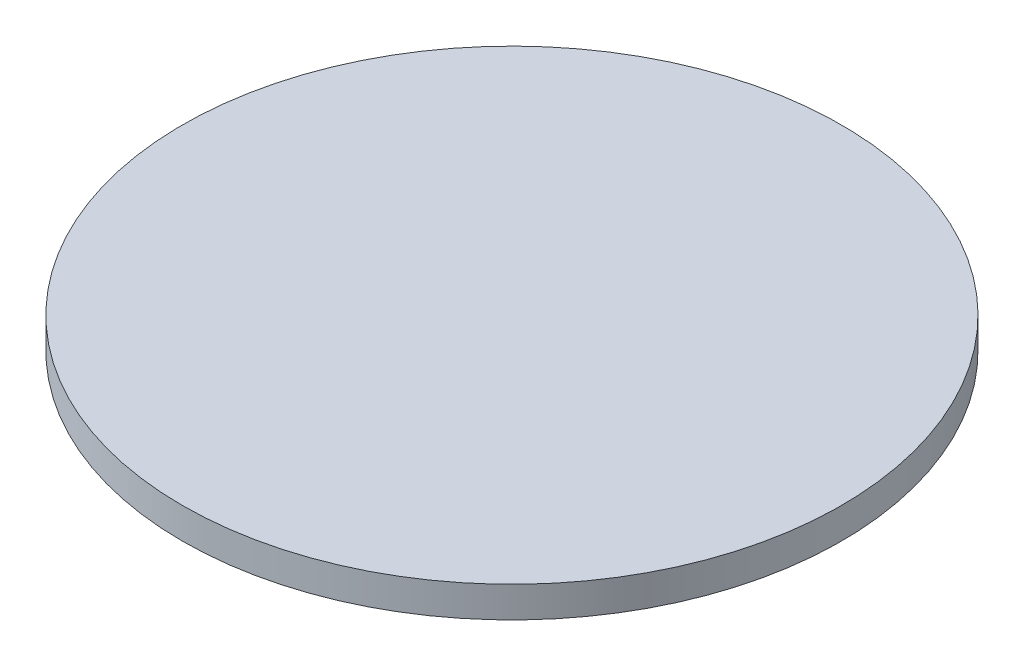
ISO-10303-21;
HEADER;
FILE_DESCRIPTION(('STEP AP214'),'2;1');
FILE_NAME('part.step','',(''),(''),'','','');
FILE_SCHEMA(('AUTOMOTIVE_DESIGN { 1 0 10303 214 1 1 1 1 }'));
ENDSEC;
DATA;
#1=APPLICATION_CONTEXT('core data for automotive mechanical design processes');
#2=APPLICATION_PROTOCOL_DEFINITION('international standard','automotive_design',2000,#1);
#3=PRODUCT_CONTEXT('',#1,'mechanical');
#4=PRODUCT('Part','Part','',(#3));
#5=PRODUCT_RELATED_PRODUCT_CATEGORY('part','',(#4));
#6=PRODUCT_DEFINITION_FORMATION('','',#4);
#7=PRODUCT_DEFINITION_CONTEXT('part definition',#1,'design');
#8=PRODUCT_DEFINITION('design','',#6,#7);
#9=PRODUCT_DEFINITION_SHAPE('','',#8);
#10=(LENGTH_UNIT() NAMED_UNIT(*) SI_UNIT(.MILLI.,.METRE.));
#11=(NAMED_UNIT(*) PLANE_ANGLE_UNIT() SI_UNIT($,.RADIAN.));
#12=(NAMED_UNIT(*) SI_UNIT($,.STERADIAN.) SOLID_ANGLE_UNIT());
#13=UNCERTAINTY_MEASURE_WITH_UNIT(LENGTH_MEASURE(1.E-05),#10,'distance_accuracy_value','');
#14=(GEOMETRIC_REPRESENTATION_CONTEXT(3) GLOBAL_UNCERTAINTY_ASSIGNED_CONTEXT((#13)) GLOBAL_UNIT_ASSIGNED_CONTEXT((#10,
#11,#12)) REPRESENTATION_CONTEXT('',''));
#15=CARTESIAN_POINT('',(0.,0.,0.));
#16=DIRECTION('',(0.,0.,1.));
#17=DIRECTION('',(1.,0.,0.));
#18=AXIS2_PLACEMENT_3D('',#15,#16,#17);
#19=CARTESIAN_POINT('',(0.,-35.,0.));
#20=DIRECTION('',(0.,1.,0.));
#21=DIRECTION('',(0.,0.,1.));
#22=AXIS2_PLACEMENT_3D('',#19,#20,#21);
#23=CYLINDRICAL_SURFACE('',#22,5.);
#24=CARTESIAN_POINT('',(0.,-35.,0.));
#25=DIRECTION('',(0.,-1.,0.));
#26=DIRECTION('',(0.,0.,-1.));
#27=AXIS2_PLACEMENT_3D('',#24,#25,#26);
#28=CIRCLE('',#27,5.);
#29=CARTESIAN_POINT('',(0.,-35.,-5.));
#30=VERTEX_POINT('',#29);
#31=EDGE_CURVE('E66',#30,#30,#28,.T.);
#32=ORIENTED_EDGE('',*,*,#31,.F.);
#33=EDGE_LOOP('',(#32));
#34=FACE_BOUND('',#33,.T.);
#35=CARTESIAN_POINT('',(0.,-20.,0.));
#36=DIRECTION('',(0.,-1.,0.));
#37=DIRECTION('',(0.,0.,-1.));
#38=AXIS2_PLACEMENT_3D('',#35,#36,#37);
#39=CIRCLE('',#38,5.);
#40=CARTESIAN_POINT('',(0.,-20.,-5.));
#41=VERTEX_POINT('',#40);
#42=EDGE_CURVE('E10',#41,#41,#39,.T.);
#43=ORIENTED_EDGE('',*,*,#42,.T.);
#44=EDGE_LOOP('',(#43));
#45=FACE_BOUND('',#44,.T.);
#46=CARTESIAN_POINT('',(-4.62493243193887,-24.,1.89999999999999));
#47=CARTESIAN_POINT('',(-4.62492829804688,-23.8975038261634,1.90000436371933));
#48=CARTESIAN_POINT('',(-4.62837659192631,-23.7950359389206,1.89167872526174));
#49=CARTESIAN_POINT('',(-4.64169676380714,-23.5931961143505,1.85875324713999));
#50=CARTESIAN_POINT('',(-4.65156831677793,-23.4938240206362,1.83415423094238));
#51=CARTESIAN_POINT('',(-4.67645875021947,-23.3011494611293,1.76972022747257));
#52=CARTESIAN_POINT('',(-4.69146498987563,-23.2078327528139,1.72992262911403));
#53=CARTESIAN_POINT('',(-4.72491334314176,-23.0291638676044,1.63635411050525));
#54=CARTESIAN_POINT('',(-4.74335651715464,-22.9438141610131,1.58257887568517));
#55=CARTESIAN_POINT('',(-4.7826556963888,-22.7791433124995,1.45964054880321));
#56=CARTESIAN_POINT('',(-4.80358397927605,-22.7002862423065,1.38987879516366));
#57=CARTESIAN_POINT('',(-4.84489323856625,-22.555062117416,1.23821697454001));
#58=CARTESIAN_POINT('',(-4.86527409330665,-22.4886978197891,1.15631423523436));
#59=CARTESIAN_POINT('',(-4.90405417834482,-22.3680905687855,0.97915619350186));
#60=CARTESIAN_POINT('',(-4.92235883280295,-22.314354400385,0.883533318585687));
#61=CARTESIAN_POINT('',(-4.95405298729702,-22.2239248669715,0.683785914181906));
#62=CARTESIAN_POINT('',(-4.9674442410237,-22.1872254199698,0.579664434268363));
#63=CARTESIAN_POINT('',(-4.98728948637783,-22.133545751922,0.370755986482188));
#64=CARTESIAN_POINT('',(-4.99402379560313,-22.1157660615263,0.266201595779868));
#65=CARTESIAN_POINT('',(-5.00080378714205,-22.097866496564,0.055390693645701));
#66=CARTESIAN_POINT('',(-5.00085170279789,-22.0977407253591,-0.0508652375897419));
#67=CARTESIAN_POINT('',(-4.99443029769439,-22.1146923471514,-0.256323260168019));
#68=CARTESIAN_POINT('',(-4.9882917999724,-22.1308964842799,-0.355609552301669));
#69=CARTESIAN_POINT('',(-4.97062354756432,-22.1785757894811,-0.549931778782861));
#70=CARTESIAN_POINT('',(-4.95909341001728,-22.2100520420345,-0.644967410765385));
#71=CARTESIAN_POINT('',(-4.93156955201664,-22.2877752074667,-0.8297489244355));
#72=CARTESIAN_POINT('',(-4.91551280108484,-22.3342321363724,-0.91939669205595));
#73=CARTESIAN_POINT('',(-4.88055443322543,-22.440410014324,-1.08984862618366));
#74=CARTESIAN_POINT('',(-4.86165188619362,-22.5001353029736,-1.17064988637926));
#75=CARTESIAN_POINT('',(-4.82160743227871,-22.6353360231854,-1.32625044008392));
#76=CARTESIAN_POINT('',(-4.80039921093498,-22.7115408166801,-1.4003998925035));
#77=CARTESIAN_POINT('',(-4.75903312517023,-22.8754223864957,-1.53511597678248));
#78=CARTESIAN_POINT('',(-4.73887554040363,-22.9631021956075,-1.59567900629085));
#79=CARTESIAN_POINT('',(-4.70146851970911,-23.1500751870288,-1.70279128624889));
#80=CARTESIAN_POINT('',(-4.68429788162558,-23.2495915454967,-1.74898072253504));
#81=CARTESIAN_POINT('',(-4.65572204531014,-23.4558149753752,-1.82369722844142));
#82=CARTESIAN_POINT('',(-4.6443135357312,-23.5625178768126,-1.85223444446238));
#83=CARTESIAN_POINT('',(-4.62933918969668,-23.7736505401753,-1.88933823586824));
#84=CARTESIAN_POINT('',(-4.62536749644316,-23.8778693574031,-1.8989399198177));
#85=CARTESIAN_POINT('',(-4.62456606150656,-24.086481913751,-1.90089286223106));
#86=CARTESIAN_POINT('',(-4.62773446513984,-24.190875600409,-1.89324860043378));
#87=CARTESIAN_POINT('',(-4.64044316636142,-24.3914813793072,-1.86186599549396));
#88=CARTESIAN_POINT('',(-4.64966187084544,-24.4878431726679,-1.83893905979756));
#89=CARTESIAN_POINT('',(-4.67304760489538,-24.6753042653513,-1.77866899519104));
#90=CARTESIAN_POINT('',(-4.68721566464055,-24.7664024644838,-1.74132286483977));
#91=CARTESIAN_POINT('',(-4.71956753441647,-24.944615300134,-1.65167467634745));
#92=CARTESIAN_POINT('',(-4.73788385975927,-25.0314456196593,-1.59885667228876));
#93=CARTESIAN_POINT('',(-4.77624987803754,-25.1953774065711,-1.48030867163641));
#94=CARTESIAN_POINT('',(-4.79630021837397,-25.2724752136334,-1.4145738407436));
#95=CARTESIAN_POINT('',(-4.83745967368334,-25.4199865977304,-1.26697281700303));
#96=CARTESIAN_POINT('',(-4.85855226248339,-25.4896331429394,-1.18433273598475));
#97=CARTESIAN_POINT('',(-4.89816727719558,-25.6141671367427,-1.00802303438766));
#98=CARTESIAN_POINT('',(-4.91668967782161,-25.669054440137,-0.914353305313363));
#99=CARTESIAN_POINT('',(-4.94907709499008,-25.7621776996371,-0.718633570628773));
#100=CARTESIAN_POINT('',(-4.96295548142365,-25.8004615521521,-0.616608693340422));
#101=CARTESIAN_POINT('',(-4.98452633675954,-25.8591005132859,-0.406917321100591));
#102=CARTESIAN_POINT('',(-4.9922218005981,-25.8794643026321,-0.299253584501064));
#103=CARTESIAN_POINT('',(-5.00026892414284,-25.9007303753911,-0.0882642447406544));
#104=CARTESIAN_POINT('',(-5.00103136453917,-25.9027213569073,0.0149369093800058));
#105=CARTESIAN_POINT('',(-4.99620513987148,-25.8900003208268,0.22014238805517));
#106=CARTESIAN_POINT('',(-4.99061727593584,-25.8752904101464,0.322146861937916));
#107=CARTESIAN_POINT('',(-4.97390940348736,-25.8303529336492,0.519407606898039));
#108=CARTESIAN_POINT('',(-4.96293459211061,-25.8005320144797,0.6147697592628));
#109=CARTESIAN_POINT('',(-4.93660372798975,-25.7266281674512,0.799140086918485));
#110=CARTESIAN_POINT('',(-4.92124684547961,-25.6825425382896,0.888147054830506));
#111=CARTESIAN_POINT('',(-4.88687043945404,-25.5792312839046,1.06142963602304));
#112=CARTESIAN_POINT('',(-4.86772291667929,-25.5194414741511,1.14534300447175));
#113=CARTESIAN_POINT('',(-4.82810857470437,-25.3873003971351,1.30227863688837));
#114=CARTESIAN_POINT('',(-4.80764128138886,-25.3149445996732,1.37529695534044));
#115=CARTESIAN_POINT('',(-4.76632308196754,-25.1550370218952,1.51247406818991));
#116=CARTESIAN_POINT('',(-4.74551213385258,-25.0668716910309,1.57593248134987));
#117=CARTESIAN_POINT('',(-4.70711465940726,-24.880473497398,1.68717136580016));
#118=CARTESIAN_POINT('',(-4.68952863714928,-24.7822390645119,1.73494938708525));
#119=CARTESIAN_POINT('',(-4.65902866082263,-24.5725859880188,1.81533006400059));
#120=CARTESIAN_POINT('',(-4.64642747848822,-24.4607384485463,1.84694547468596));
#121=CARTESIAN_POINT('',(-4.62938461098142,-24.2325796486916,1.88927053159532));
#122=CARTESIAN_POINT('',(-4.62493712142451,-24.1162716238664,1.89999504979831));
#123=CARTESIAN_POINT('',(-4.62493243193887,-24.,1.89999999999999));
#124=B_SPLINE_CURVE_WITH_KNOTS('',3,(#46,#47,#48,#49,#50,#51,#52,#53,#54,#55,#56,#57,#58,#59,
#60,#61,#62,#63,#64,#65,#66,#67,#68,#69,#70,#71,#72,#73,#74,#75,#76,#77,#78,#79,#80,#81,#82,#83,
#84,#85,#86,#87,#88,#89,#90,#91,#92,#93,#94,#95,#96,#97,#98,#99,#100,#101,#102,#103,#104,#105,
#106,#107,#108,#109,#110,#111,#112,#113,#114,#115,#116,#117,#118,#119,#120,#121,#122,#123),
.UNSPECIFIED.,.T.,.F.,(4,2,2,2,2,2,2,2,2,2,2,2,2,2,2,2,2,2,2,2,2,2,2,2,2,2,2,2,2,2,2,2,2,2,2,2,
2,2,4),(0.,0.307055262679176,0.614094988915586,0.920384204748324,1.22676807741568,
1.54738115755826,1.86806491210605,2.19999633923146,2.53180917789548,2.84896440658,
3.16601370104911,3.46696316769757,3.76793400804709,4.07332236002851,4.37881074100048,
4.70260581420842,5.02648663835537,5.35792185020603,5.689166377432,6.00173780540237,
6.31422805040051,6.61132384190776,6.9084815090414,7.21696915536267,7.52557247806822,
7.85436073131817,8.18315221903456,8.5109888203087,8.83866652542134,9.14679294287423,
9.4548804926754,9.75508565191427,10.0553476941945,10.3683804775257,10.6815263483378,
11.0117508535567,11.3420269306387,11.6905985483951,12.0389219313281),.UNSPECIFIED.);
#125=CARTESIAN_POINT('',(-4.62493243193887,-24.,1.89999999999999));
#126=VERTEX_POINT('',#125);
#127=EDGE_CURVE('E76',#126,#126,#124,.T.);
#128=ORIENTED_EDGE('',*,*,#127,.F.);
#129=EDGE_LOOP('',(#128));
#130=FACE_BOUND('',#129,.T.);
#131=CARTESIAN_POINT('',(4.62493243193887,-24.,1.89999999999999));
#132=CARTESIAN_POINT('',(4.62492829804688,-24.1024961738366,1.90000436371933));
#133=CARTESIAN_POINT('',(4.62837659192632,-24.2049640610794,1.89167872526174));
#134=CARTESIAN_POINT('',(4.64169676380714,-24.4068038856495,1.85875324713999));
#135=CARTESIAN_POINT('',(4.65156831677793,-24.5061759793639,1.83415423094238));
#136=CARTESIAN_POINT('',(4.67645875021947,-24.6988505388707,1.76972022747257));
#137=CARTESIAN_POINT('',(4.69146498987563,-24.7921672471861,1.72992262911403));
#138=CARTESIAN_POINT('',(4.72491334314176,-24.9708361323956,1.63635411050525));
#139=CARTESIAN_POINT('',(4.74335651715464,-25.0561858389869,1.58257887568517));
#140=CARTESIAN_POINT('',(4.7826556963888,-25.2208566875006,1.45964054880321));
#141=CARTESIAN_POINT('',(4.80358397927605,-25.2997137576935,1.38987879516366));
#142=CARTESIAN_POINT('',(4.84489323856625,-25.444937882584,1.23821697454001));
#143=CARTESIAN_POINT('',(4.86527409330665,-25.5113021802109,1.15631423523436));
#144=CARTESIAN_POINT('',(4.90405417834482,-25.6319094312145,0.97915619350186));
#145=CARTESIAN_POINT('',(4.92235883280295,-25.685645599615,0.883533318585686));
#146=CARTESIAN_POINT('',(4.95405298729702,-25.7760751330285,0.683785914181905));
#147=CARTESIAN_POINT('',(4.9674442410237,-25.8127745800302,0.579664434268363));
#148=CARTESIAN_POINT('',(4.98728948637783,-25.866454248078,0.370755986482188));
#149=CARTESIAN_POINT('',(4.99402379560313,-25.8842339384737,0.266201595779868));
#150=CARTESIAN_POINT('',(5.00080378714205,-25.902133503436,0.0553906936457008));
#151=CARTESIAN_POINT('',(5.00085170279789,-25.9022592746409,-0.050865237589742));
#152=CARTESIAN_POINT('',(4.99443029769439,-25.8853076528486,-0.256323260168018));
#153=CARTESIAN_POINT('',(4.98829179997241,-25.8691035157202,-0.355609552301667));
#154=CARTESIAN_POINT('',(4.97062354756432,-25.8214242105189,-0.549931778782859));
#155=CARTESIAN_POINT('',(4.95909341001728,-25.7899479579655,-0.644967410765384));
#156=CARTESIAN_POINT('',(4.93156955201664,-25.7122247925333,-0.8297489244355));
#157=CARTESIAN_POINT('',(4.91551280108484,-25.6657678636276,-0.91939669205595));
#158=CARTESIAN_POINT('',(4.88055443322543,-25.5595899856761,-1.08984862618366));
#159=CARTESIAN_POINT('',(4.86165188619362,-25.4998646970264,-1.17064988637926));
#160=CARTESIAN_POINT('',(4.82160743227871,-25.3646639768146,-1.32625044008392));
#161=CARTESIAN_POINT('',(4.80039921093498,-25.2884591833199,-1.40039989250351));
#162=CARTESIAN_POINT('',(4.75903312517024,-25.1245776135043,-1.53511597678248));
#163=CARTESIAN_POINT('',(4.73887554040363,-25.0368978043925,-1.59567900629085));
#164=CARTESIAN_POINT('',(4.70146851970911,-24.8499248129712,-1.70279128624889));
#165=CARTESIAN_POINT('',(4.68429788162558,-24.7504084545034,-1.74898072253504));
#166=CARTESIAN_POINT('',(4.65572204531014,-24.5441850246248,-1.82369722844142));
#167=CARTESIAN_POINT('',(4.6443135357312,-24.4374821231874,-1.85223444446238));
#168=CARTESIAN_POINT('',(4.62933918969668,-24.2263494598247,-1.88933823586824));
#169=CARTESIAN_POINT('',(4.62536749644316,-24.1221306425969,-1.89893991981769));
#170=CARTESIAN_POINT('',(4.62456606150656,-23.913518086249,-1.90089286223106));
#171=CARTESIAN_POINT('',(4.62773446513985,-23.809124399591,-1.89324860043378));
#172=CARTESIAN_POINT('',(4.64044316636142,-23.6085186206928,-1.86186599549396));
#173=CARTESIAN_POINT('',(4.64966187084544,-23.5121568273321,-1.83893905979756));
#174=CARTESIAN_POINT('',(4.67304760489538,-23.3246957346487,-1.77866899519104));
#175=CARTESIAN_POINT('',(4.68721566464055,-23.2335975355162,-1.74132286483977));
#176=CARTESIAN_POINT('',(4.71956753441647,-23.055384699866,-1.65167467634745));
#177=CARTESIAN_POINT('',(4.73788385975928,-22.9685543803407,-1.59885667228876));
#178=CARTESIAN_POINT('',(4.77624987803754,-22.804622593429,-1.48030867163641));
#179=CARTESIAN_POINT('',(4.79630021837397,-22.7275247863666,-1.4145738407436));
#180=CARTESIAN_POINT('',(4.83745967368334,-22.5800134022696,-1.26697281700303));
#181=CARTESIAN_POINT('',(4.85855226248339,-22.5103668570606,-1.18433273598475));
#182=CARTESIAN_POINT('',(4.89816727719558,-22.3858328632574,-1.00802303438766));
#183=CARTESIAN_POINT('',(4.91668967782161,-22.330945559863,-0.914353305313363));
#184=CARTESIAN_POINT('',(4.94907709499008,-22.237822300363,-0.718633570628773));
#185=CARTESIAN_POINT('',(4.96295548142365,-22.1995384478479,-0.616608693340422));
#186=CARTESIAN_POINT('',(4.98452633675954,-22.1408994867141,-0.406917321100591));
#187=CARTESIAN_POINT('',(4.9922218005981,-22.1205356973679,-0.299253584501064));
#188=CARTESIAN_POINT('',(5.00026892414284,-22.099269624609,-0.0882642447406544));
#189=CARTESIAN_POINT('',(5.00103136453917,-22.0972786430927,0.0149369093800058));
#190=CARTESIAN_POINT('',(4.99620513987148,-22.1099996791732,0.22014238805517));
#191=CARTESIAN_POINT('',(4.99061727593584,-22.1247095898536,0.322146861937916));
#192=CARTESIAN_POINT('',(4.97390940348736,-22.1696470663508,0.519407606898038));
#193=CARTESIAN_POINT('',(4.96293459211061,-22.1994679855204,0.6147697592628));
#194=CARTESIAN_POINT('',(4.93660372798975,-22.2733718325488,0.799140086918485));
#195=CARTESIAN_POINT('',(4.92124684547961,-22.3174574617104,0.888147054830506));
#196=CARTESIAN_POINT('',(4.88687043945404,-22.4207687160954,1.06142963602304));
#197=CARTESIAN_POINT('',(4.86772291667929,-22.4805585258489,1.14534300447175));
#198=CARTESIAN_POINT('',(4.82810857470437,-22.6126996028649,1.30227863688837));
#199=CARTESIAN_POINT('',(4.80764128138886,-22.6850554003268,1.37529695534044));
#200=CARTESIAN_POINT('',(4.76632308196754,-22.8449629781048,1.51247406818991));
#201=CARTESIAN_POINT('',(4.74551213385259,-22.9331283089691,1.57593248134987));
#202=CARTESIAN_POINT('',(4.70711465940726,-23.119526502602,1.68717136580016));
#203=CARTESIAN_POINT('',(4.68952863714928,-23.2177609354881,1.73494938708525));
#204=CARTESIAN_POINT('',(4.65902866082263,-23.4274140119812,1.81533006400059));
#205=CARTESIAN_POINT('',(4.64642747848822,-23.5392615514537,1.84694547468596));
#206=CARTESIAN_POINT('',(4.62938461098142,-23.7674203513084,1.88927053159532));
#207=CARTESIAN_POINT('',(4.62493712142451,-23.8837283761336,1.89999504979831));
#208=CARTESIAN_POINT('',(4.62493243193887,-24.,1.89999999999999));
#209=B_SPLINE_CURVE_WITH_KNOTS('',3,(#131,#132,#133,#134,#135,#136,#137,#138,#139,#140,#141,
#142,#143,#144,#145,#146,#147,#148,#149,#150,#151,#152,#153,#154,#155,#156,#157,#158,#159,#160,
#161,#162,#163,#164,#165,#166,#167,#168,#169,#170,#171,#172,#173,#174,#175,#176,#177,#178,#179,
#180,#181,#182,#183,#184,#185,#186,#187,#188,#189,#190,#191,#192,#193,#194,#195,#196,#197,#198,
#199,#200,#201,#202,#203,#204,#205,#206,#207,#208),.UNSPECIFIED.,.T.,.F.,(4,2,2,2,2,2,2,2,2,2,2,
2,2,2,2,2,2,2,2,2,2,2,2,2,2,2,2,2,2,2,2,2,2,2,2,2,2,2,4),(0.,0.30705526267918,0.614094988915586,
0.920384204748324,1.22676807741568,1.54738115755826,1.86806491210605,2.19999633923146,
2.53180917789548,2.84896440658,3.16601370104911,3.46696316769757,3.76793400804709,
4.07332236002851,4.37881074100048,4.70260581420843,5.02648663835537,5.35792185020603,
5.689166377432,6.00173780540237,6.31422805040051,6.61132384190777,6.9084815090414,
7.21696915536267,7.52557247806822,7.85436073131817,8.18315221903456,8.5109888203087,
8.83866652542134,9.14679294287423,9.4548804926754,9.75508565191427,10.0553476941945,
10.3683804775257,10.6815263483378,11.0117508535567,11.3420269306387,11.6905985483951,
12.0389219313281),.UNSPECIFIED.);
#210=CARTESIAN_POINT('',(4.62493243193887,-24.,1.89999999999999));
#211=VERTEX_POINT('',#210);
#212=EDGE_CURVE('E84',#211,#211,#209,.T.);
#213=ORIENTED_EDGE('',*,*,#212,.F.);
#214=EDGE_LOOP('',(#213));
#215=FACE_BOUND('',#214,.T.);
#216=CARTESIAN_POINT('',(-4.62493243193887,-31.,1.89999999999999));
#217=CARTESIAN_POINT('',(-4.62492829804688,-30.8975038261634,1.90000436371932));
#218=CARTESIAN_POINT('',(-4.62837659192632,-30.7950359389206,1.89167872526174));
#219=CARTESIAN_POINT('',(-4.64169676380714,-30.5931961143505,1.85875324713999));
#220=CARTESIAN_POINT('',(-4.65156831677793,-30.4938240206362,1.83415423094238));
#221=CARTESIAN_POINT('',(-4.67645875021947,-30.3011494611293,1.76972022747257));
#222=CARTESIAN_POINT('',(-4.69146498987563,-30.2078327528139,1.72992262911403));
#223=CARTESIAN_POINT('',(-4.72491334314176,-30.0291638676044,1.63635411050525));
#224=CARTESIAN_POINT('',(-4.74335651715464,-29.9438141610131,1.58257887568517));
#225=CARTESIAN_POINT('',(-4.7826556963888,-29.7791433124995,1.45964054880321));
#226=CARTESIAN_POINT('',(-4.80358397927605,-29.7002862423065,1.38987879516366));
#227=CARTESIAN_POINT('',(-4.84489323856625,-29.555062117416,1.23821697454001));
#228=CARTESIAN_POINT('',(-4.86527409330665,-29.4886978197891,1.15631423523436));
#229=CARTESIAN_POINT('',(-4.90405417834482,-29.3680905687855,0.97915619350186));
#230=CARTESIAN_POINT('',(-4.92235883280295,-29.314354400385,0.883533318585687));
#231=CARTESIAN_POINT('',(-4.95405298729702,-29.2239248669715,0.683785914181907));
#232=CARTESIAN_POINT('',(-4.9674442410237,-29.1872254199698,0.579664434268364));
#233=CARTESIAN_POINT('',(-4.98728948637783,-29.133545751922,0.370755986482188));
#234=CARTESIAN_POINT('',(-4.99402379560313,-29.1157660615263,0.266201595779867));
#235=CARTESIAN_POINT('',(-5.00080378714205,-29.097866496564,0.0553906936456992));
#236=CARTESIAN_POINT('',(-5.00085170279789,-29.0977407253591,-0.0508652375897441));
#237=CARTESIAN_POINT('',(-4.99443029769439,-29.1146923471514,-0.256323260168021));
#238=CARTESIAN_POINT('',(-4.9882917999724,-29.1308964842799,-0.35560955230167));
#239=CARTESIAN_POINT('',(-4.97062354756432,-29.1785757894811,-0.549931778782862));
#240=CARTESIAN_POINT('',(-4.95909341001728,-29.2100520420345,-0.644967410765386));
#241=CARTESIAN_POINT('',(-4.93156955201664,-29.2877752074667,-0.829748924435501));
#242=CARTESIAN_POINT('',(-4.91551280108484,-29.3342321363724,-0.919396692055952));
#243=CARTESIAN_POINT('',(-4.88055443322543,-29.440410014324,-1.08984862618366));
#244=CARTESIAN_POINT('',(-4.86165188619362,-29.5001353029736,-1.17064988637926));
#245=CARTESIAN_POINT('',(-4.82160743227871,-29.6353360231854,-1.32625044008392));
#246=CARTESIAN_POINT('',(-4.80039921093498,-29.7115408166801,-1.4003998925035));
#247=CARTESIAN_POINT('',(-4.75903312517024,-29.8754223864957,-1.53511597678248));
#248=CARTESIAN_POINT('',(-4.73887554040363,-29.9631021956075,-1.59567900629085));
#249=CARTESIAN_POINT('',(-4.70146851970911,-30.1500751870288,-1.70279128624889));
#250=CARTESIAN_POINT('',(-4.68429788162558,-30.2495915454966,-1.74898072253504));
#251=CARTESIAN_POINT('',(-4.65572204531014,-30.4558149753752,-1.82369722844142));
#252=CARTESIAN_POINT('',(-4.64431353573119,-30.5625178768126,-1.85223444446238));
#253=CARTESIAN_POINT('',(-4.62933918969667,-30.7736505401753,-1.88933823586824));
#254=CARTESIAN_POINT('',(-4.62536749644316,-30.8778693574031,-1.8989399198177));
#255=CARTESIAN_POINT('',(-4.62456606150656,-31.086481913751,-1.90089286223106));
#256=CARTESIAN_POINT('',(-4.62773446513984,-31.190875600409,-1.89324860043378));
#257=CARTESIAN_POINT('',(-4.64044316636142,-31.3914813793072,-1.86186599549396));
#258=CARTESIAN_POINT('',(-4.64966187084543,-31.4878431726679,-1.83893905979756));
#259=CARTESIAN_POINT('',(-4.67304760489538,-31.6753042653513,-1.77866899519104));
#260=CARTESIAN_POINT('',(-4.68721566464055,-31.7664024644838,-1.74132286483977));
#261=CARTESIAN_POINT('',(-4.71956753441647,-31.944615300134,-1.65167467634746));
#262=CARTESIAN_POINT('',(-4.73788385975927,-32.0314456196593,-1.59885667228877));
#263=CARTESIAN_POINT('',(-4.77624987803754,-32.1953774065711,-1.48030867163641));
#264=CARTESIAN_POINT('',(-4.79630021837397,-32.2724752136334,-1.41457384074361));
#265=CARTESIAN_POINT('',(-4.83745967368334,-32.4199865977304,-1.26697281700304));
#266=CARTESIAN_POINT('',(-4.85855226248339,-32.4896331429394,-1.18433273598475));
#267=CARTESIAN_POINT('',(-4.89816727719558,-32.6141671367427,-1.00802303438767));
#268=CARTESIAN_POINT('',(-4.91668967782161,-32.669054440137,-0.914353305313365));
#269=CARTESIAN_POINT('',(-4.94907709499008,-32.7621776996371,-0.718633570628773));
#270=CARTESIAN_POINT('',(-4.96295548142365,-32.8004615521521,-0.616608693340423));
#271=CARTESIAN_POINT('',(-4.98452633675954,-32.8591005132859,-0.406917321100591));
#272=CARTESIAN_POINT('',(-4.9922218005981,-32.8794643026321,-0.299253584501063));
#273=CARTESIAN_POINT('',(-5.00026892414284,-32.9007303753911,-0.0882642447406534));
#274=CARTESIAN_POINT('',(-5.00103136453917,-32.9027213569073,0.0149369093800061));
#275=CARTESIAN_POINT('',(-4.99620513987148,-32.8900003208268,0.22014238805517));
#276=CARTESIAN_POINT('',(-4.99061727593584,-32.8752904101464,0.322146861937916));
#277=CARTESIAN_POINT('',(-4.97390940348736,-32.8303529336492,0.519407606898038));
#278=CARTESIAN_POINT('',(-4.96293459211061,-32.8005320144797,0.6147697592628));
#279=CARTESIAN_POINT('',(-4.93660372798975,-32.7266281674512,0.799140086918485));
#280=CARTESIAN_POINT('',(-4.92124684547961,-32.6825425382896,0.888147054830505));
#281=CARTESIAN_POINT('',(-4.88687043945404,-32.5792312839046,1.06142963602304));
#282=CARTESIAN_POINT('',(-4.86772291667929,-32.5194414741511,1.14534300447175));
#283=CARTESIAN_POINT('',(-4.82810857470437,-32.3873003971351,1.30227863688837));
#284=CARTESIAN_POINT('',(-4.80764128138886,-32.3149445996732,1.37529695534044));
#285=CARTESIAN_POINT('',(-4.76632308196754,-32.1550370218952,1.51247406818991));
#286=CARTESIAN_POINT('',(-4.74551213385259,-32.0668716910309,1.57593248134987));
#287=CARTESIAN_POINT('',(-4.70711465940726,-31.880473497398,1.68717136580016));
#288=CARTESIAN_POINT('',(-4.68952863714928,-31.7822390645119,1.73494938708525));
#289=CARTESIAN_POINT('',(-4.65902866082263,-31.5725859880188,1.81533006400059));
#290=CARTESIAN_POINT('',(-4.64642747848822,-31.4607384485463,1.84694547468596));
#291=CARTESIAN_POINT('',(-4.62938461098142,-31.2325796486916,1.88927053159532));
#292=CARTESIAN_POINT('',(-4.62493712142451,-31.1162716238664,1.89999504979831));
#293=CARTESIAN_POINT('',(-4.62493243193887,-31.,1.89999999999999));
#294=B_SPLINE_CURVE_WITH_KNOTS('',3,(#216,#217,#218,#219,#220,#221,#222,#223,#224,#225,#226,
#227,#228,#229,#230,#231,#232,#233,#234,#235,#236,#237,#238,#239,#240,#241,#242,#243,#244,#245,
#246,#247,#248,#249,#250,#251,#252,#253,#254,#255,#256,#257,#258,#259,#260,#261,#262,#263,#264,
#265,#266,#267,#268,#269,#270,#271,#272,#273,#274,#275,#276,#277,#278,#279,#280,#281,#282,#283,
#284,#285,#286,#287,#288,#289,#290,#291,#292,#293),.UNSPECIFIED.,.T.,.F.,(4,2,2,2,2,2,2,2,2,2,2,
2,2,2,2,2,2,2,2,2,2,2,2,2,2,2,2,2,2,2,2,2,2,2,2,2,2,2,4),(0.,0.307055262679176,
0.614094988915586,0.920384204748324,1.22676807741568,1.54738115755826,1.86806491210605,
2.19999633923146,2.53180917789548,2.84896440658,3.16601370104911,3.46696316769757,
3.76793400804709,4.07332236002851,4.37881074100048,4.70260581420842,5.02648663835537,
5.35792185020603,5.689166377432,6.00173780540238,6.31422805040052,6.61132384190777,
6.90848150904141,7.21696915536267,7.52557247806822,7.85436073131818,8.18315221903457,
8.51098882030871,8.83866652542135,9.14679294287423,9.45488049267541,9.75508565191428,
10.0553476941945,10.3683804775257,10.6815263483378,11.0117508535567,11.3420269306387,
11.6905985483952,12.0389219313281),.UNSPECIFIED.);
#295=CARTESIAN_POINT('',(-4.62493243193887,-31.,1.89999999999999));
#296=VERTEX_POINT('',#295);
#297=EDGE_CURVE('E125',#296,#296,#294,.T.);
#298=ORIENTED_EDGE('',*,*,#297,.F.);
#299=EDGE_LOOP('',(#298));
#300=FACE_BOUND('',#299,.T.);
#301=CARTESIAN_POINT('',(4.62493243193887,-31.,1.89999999999999));
#302=CARTESIAN_POINT('',(4.62492829804688,-31.1024961738366,1.90000436371932));
#303=CARTESIAN_POINT('',(4.62837659192631,-31.2049640610794,1.89167872526174));
#304=CARTESIAN_POINT('',(4.64169676380714,-31.4068038856495,1.85875324713999));
#305=CARTESIAN_POINT('',(4.65156831677793,-31.5061759793639,1.83415423094238));
#306=CARTESIAN_POINT('',(4.67645875021947,-31.6988505388707,1.76972022747257));
#307=CARTESIAN_POINT('',(4.69146498987563,-31.7921672471861,1.72992262911403));
#308=CARTESIAN_POINT('',(4.72491334314176,-31.9708361323956,1.63635411050526));
#309=CARTESIAN_POINT('',(4.74335651715464,-32.0561858389869,1.58257887568517));
#310=CARTESIAN_POINT('',(4.7826556963888,-32.2208566875006,1.45964054880322));
#311=CARTESIAN_POINT('',(4.80358397927605,-32.2997137576935,1.38987879516366));
#312=CARTESIAN_POINT('',(4.84489323856625,-32.444937882584,1.23821697454001));
#313=CARTESIAN_POINT('',(4.86527409330665,-32.5113021802109,1.15631423523436));
#314=CARTESIAN_POINT('',(4.90405417834482,-32.6319094312145,0.979156193501857));
#315=CARTESIAN_POINT('',(4.92235883280295,-32.685645599615,0.883533318585685));
#316=CARTESIAN_POINT('',(4.95405298729702,-32.7760751330285,0.683785914181906));
#317=CARTESIAN_POINT('',(4.9674442410237,-32.8127745800302,0.579664434268363));
#318=CARTESIAN_POINT('',(4.98728948637783,-32.866454248078,0.370755986482189));
#319=CARTESIAN_POINT('',(4.99402379560313,-32.8842339384737,0.266201595779869));
#320=CARTESIAN_POINT('',(5.00080378714205,-32.902133503436,0.055390693645702));
#321=CARTESIAN_POINT('',(5.00085170279789,-32.9022592746409,-0.0508652375897408));
#322=CARTESIAN_POINT('',(4.99443029769439,-32.8853076528486,-0.256323260168017));
#323=CARTESIAN_POINT('',(4.9882917999724,-32.8691035157202,-0.355609552301667));
#324=CARTESIAN_POINT('',(4.97062354756432,-32.8214242105189,-0.54993177878286));
#325=CARTESIAN_POINT('',(4.95909341001728,-32.7899479579655,-0.644967410765384));
#326=CARTESIAN_POINT('',(4.93156955201664,-32.7122247925333,-0.8297489244355));
#327=CARTESIAN_POINT('',(4.91551280108484,-32.6657678636276,-0.91939669205595));
#328=CARTESIAN_POINT('',(4.88055443322543,-32.559589985676,-1.08984862618366));
#329=CARTESIAN_POINT('',(4.86165188619362,-32.4998646970264,-1.17064988637925));
#330=CARTESIAN_POINT('',(4.82160743227871,-32.3646639768146,-1.32625044008392));
#331=CARTESIAN_POINT('',(4.80039921093498,-32.28845918332,-1.4003998925035));
#332=CARTESIAN_POINT('',(4.75903312517024,-32.1245776135043,-1.53511597678248));
#333=CARTESIAN_POINT('',(4.73887554040363,-32.0368978043925,-1.59567900629084));
#334=CARTESIAN_POINT('',(4.70146851970911,-31.8499248129712,-1.70279128624889));
#335=CARTESIAN_POINT('',(4.68429788162558,-31.7504084545034,-1.74898072253504));
#336=CARTESIAN_POINT('',(4.65572204531013,-31.5441850246248,-1.82369722844142));
#337=CARTESIAN_POINT('',(4.64431353573119,-31.4374821231874,-1.85223444446238));
#338=CARTESIAN_POINT('',(4.62933918969667,-31.2263494598247,-1.88933823586824));
#339=CARTESIAN_POINT('',(4.62536749644316,-31.1221306425969,-1.8989399198177));
#340=CARTESIAN_POINT('',(4.62456606150656,-30.913518086249,-1.90089286223106));
#341=CARTESIAN_POINT('',(4.62773446513984,-30.809124399591,-1.89324860043378));
#342=CARTESIAN_POINT('',(4.64044316636142,-30.6085186206928,-1.86186599549397));
#343=CARTESIAN_POINT('',(4.64966187084543,-30.5121568273321,-1.83893905979756));
#344=CARTESIAN_POINT('',(4.67304760489538,-30.3246957346487,-1.77866899519104));
#345=CARTESIAN_POINT('',(4.68721566464055,-30.2335975355162,-1.74132286483978));
#346=CARTESIAN_POINT('',(4.71956753441647,-30.055384699866,-1.65167467634746));
#347=CARTESIAN_POINT('',(4.73788385975927,-29.9685543803407,-1.59885667228876));
#348=CARTESIAN_POINT('',(4.77624987803754,-29.804622593429,-1.48030867163641));
#349=CARTESIAN_POINT('',(4.79630021837397,-29.7275247863667,-1.41457384074361));
#350=CARTESIAN_POINT('',(4.83745967368334,-29.5800134022696,-1.26697281700304));
#351=CARTESIAN_POINT('',(4.85855226248339,-29.5103668570606,-1.18433273598475));
#352=CARTESIAN_POINT('',(4.89816727719558,-29.3858328632574,-1.00802303438767));
#353=CARTESIAN_POINT('',(4.91668967782161,-29.330945559863,-0.914353305313369));
#354=CARTESIAN_POINT('',(4.94907709499008,-29.237822300363,-0.718633570628778));
#355=CARTESIAN_POINT('',(4.96295548142365,-29.1995384478479,-0.616608693340427));
#356=CARTESIAN_POINT('',(4.98452633675954,-29.1408994867141,-0.406917321100595));
#357=CARTESIAN_POINT('',(4.9922218005981,-29.1205356973679,-0.299253584501068));
#358=CARTESIAN_POINT('',(5.00026892414284,-29.0992696246089,-0.0882642447406577));
#359=CARTESIAN_POINT('',(5.00103136453917,-29.0972786430927,0.0149369093800022));
#360=CARTESIAN_POINT('',(4.99620513987148,-29.1099996791732,0.220142388055167));
#361=CARTESIAN_POINT('',(4.99061727593584,-29.1247095898536,0.322146861937912));
#362=CARTESIAN_POINT('',(4.97390940348736,-29.1696470663508,0.519407606898034));
#363=CARTESIAN_POINT('',(4.96293459211061,-29.1994679855204,0.614769759262796));
#364=CARTESIAN_POINT('',(4.93660372798975,-29.2733718325488,0.799140086918481));
#365=CARTESIAN_POINT('',(4.92124684547961,-29.3174574617104,0.888147054830502));
#366=CARTESIAN_POINT('',(4.88687043945404,-29.4207687160954,1.06142963602304));
#367=CARTESIAN_POINT('',(4.86772291667929,-29.4805585258489,1.14534300447175));
#368=CARTESIAN_POINT('',(4.82810857470437,-29.6126996028649,1.30227863688836));
#369=CARTESIAN_POINT('',(4.80764128138886,-29.6850554003268,1.37529695534044));
#370=CARTESIAN_POINT('',(4.76632308196754,-29.8449629781048,1.51247406818991));
#371=CARTESIAN_POINT('',(4.74551213385259,-29.9331283089691,1.57593248134987));
#372=CARTESIAN_POINT('',(4.70711465940726,-30.119526502602,1.68717136580016));
#373=CARTESIAN_POINT('',(4.68952863714928,-30.2177609354881,1.73494938708525));
#374=CARTESIAN_POINT('',(4.65902866082263,-30.4274140119812,1.81533006400059));
#375=CARTESIAN_POINT('',(4.64642747848822,-30.5392615514537,1.84694547468596));
#376=CARTESIAN_POINT('',(4.62938461098142,-30.7674203513084,1.88927053159532));
#377=CARTESIAN_POINT('',(4.62493712142451,-30.8837283761336,1.89999504979831));
#378=CARTESIAN_POINT('',(4.62493243193887,-31.,1.89999999999999));
#379=B_SPLINE_CURVE_WITH_KNOTS('',3,(#301,#302,#303,#304,#305,#306,#307,#308,#309,#310,#311,
#312,#313,#314,#315,#316,#317,#318,#319,#320,#321,#322,#323,#324,#325,#326,#327,#328,#329,#330,
#331,#332,#333,#334,#335,#336,#337,#338,#339,#340,#341,#342,#343,#344,#345,#346,#347,#348,#349,
#350,#351,#352,#353,#354,#355,#356,#357,#358,#359,#360,#361,#362,#363,#364,#365,#366,#367,#368,
#369,#370,#371,#372,#373,#374,#375,#376,#377,#378),.UNSPECIFIED.,.T.,.F.,(4,2,2,2,2,2,2,2,2,2,2,
2,2,2,2,2,2,2,2,2,2,2,2,2,2,2,2,2,2,2,2,2,2,2,2,2,2,2,4),(0.,0.307055262679173,
0.614094988915586,0.920384204748324,1.22676807741567,1.54738115755826,1.86806491210606,
2.19999633923146,2.53180917789548,2.84896440657999,3.16601370104911,3.46696316769757,
3.76793400804709,4.07332236002851,4.37881074100048,4.70260581420842,5.02648663835536,
5.35792185020602,5.68916637743199,6.00173780540237,6.31422805040051,6.61132384190776,
6.9084815090414,7.21696915536267,7.52557247806821,7.85436073131817,8.18315221903456,
8.5109888203087,8.83866652542134,9.14679294287423,9.45488049267541,9.75508565191427,
10.0553476941945,10.3683804775257,10.6815263483378,11.0117508535567,11.3420269306387,
11.6905985483952,12.0389219313281),.UNSPECIFIED.);
#380=CARTESIAN_POINT('',(4.62493243193887,-31.,1.89999999999999));
#381=VERTEX_POINT('',#380);
#382=EDGE_CURVE('E44',#381,#381,#379,.T.);
#383=ORIENTED_EDGE('',*,*,#382,.F.);
#384=EDGE_LOOP('',(#383));
#385=FACE_BOUND('',#384,.T.);
#386=ADVANCED_FACE('F40',(#34,#45,#130,#215,#300,#385),#23,.T.);
#387=CARTESIAN_POINT('',(0.,6.,0.));
#388=DIRECTION('',(0.,-1.,0.));
#389=DIRECTION('',(0.,0.,-1.));
#390=AXIS2_PLACEMENT_3D('',#387,#388,#389);
#391=CYLINDRICAL_SURFACE('',#390,64.);
#392=CARTESIAN_POINT('',(0.,6.,0.));
#393=DIRECTION('',(0.,1.,0.));
#394=DIRECTION('',(0.,0.,1.));
#395=AXIS2_PLACEMENT_3D('',#392,#393,#394);
#396=CIRCLE('',#395,64.);
#397=CARTESIAN_POINT('',(0.,6.,64.));
#398=VERTEX_POINT('',#397);
#399=EDGE_CURVE('E62',#398,#398,#396,.T.);
#400=ORIENTED_EDGE('',*,*,#399,.F.);
#401=EDGE_LOOP('',(#400));
#402=FACE_BOUND('',#401,.T.);
#403=CARTESIAN_POINT('',(0.,0.,0.));
#404=DIRECTION('',(0.,1.,0.));
#405=DIRECTION('',(0.,0.,1.));
#406=AXIS2_PLACEMENT_3D('',#403,#404,#405);
#407=CIRCLE('',#406,64.);
#408=CARTESIAN_POINT('',(0.,0.,64.));
#409=VERTEX_POINT('',#408);
#410=EDGE_CURVE('E70',#409,#409,#407,.T.);
#411=ORIENTED_EDGE('',*,*,#410,.T.);
#412=EDGE_LOOP('',(#411));
#413=FACE_BOUND('',#412,.T.);
#414=ADVANCED_FACE('F42',(#402,#413),#391,.T.);
#415=CARTESIAN_POINT('',(0.,6.,0.));
#416=DIRECTION('',(0.,1.,0.));
#417=DIRECTION('',(0.,0.,1.));
#418=AXIS2_PLACEMENT_3D('',#415,#416,#417);
#419=PLANE('',#418);
#420=ORIENTED_EDGE('',*,*,#399,.T.);
#421=EDGE_LOOP('',(#420));
#422=FACE_BOUND('',#421,.T.);
#423=ADVANCED_FACE('F113',(#422),#419,.T.);
#424=CARTESIAN_POINT('',(0.,0.,0.));
#425=DIRECTION('',(0.,1.,0.));
#426=DIRECTION('',(0.,0.,1.));
#427=AXIS2_PLACEMENT_3D('',#424,#425,#426);
#428=PLANE('',#427);
#429=CARTESIAN_POINT('',(0.,0.,0.));
#430=DIRECTION('',(0.,1.,0.));
#431=DIRECTION('',(0.,0.,1.));
#432=AXIS2_PLACEMENT_3D('',#429,#430,#431);
#433=CIRCLE('',#432,7.25);
#434=CARTESIAN_POINT('',(0.,0.,7.25));
#435=VERTEX_POINT('',#434);
#436=EDGE_CURVE('E54',#435,#435,#433,.F.);
#437=ORIENTED_EDGE('',*,*,#436,.F.);
#438=EDGE_LOOP('',(#437));
#439=FACE_BOUND('',#438,.T.);
#440=ORIENTED_EDGE('',*,*,#410,.F.);
#441=EDGE_LOOP('',(#440));
#442=FACE_BOUND('',#441,.T.);
#443=ADVANCED_FACE('F160',(#439,#442),#428,.F.);
#444=CARTESIAN_POINT('',(0.,-20.,0.));
#445=DIRECTION('',(0.,1.,0.));
#446=DIRECTION('',(0.,0.,1.));
#447=AXIS2_PLACEMENT_3D('',#444,#445,#446);
#448=CYLINDRICAL_SURFACE('',#447,7.25);
#449=CARTESIAN_POINT('',(0.,-20.,0.));
#450=DIRECTION('',(0.,-1.,0.));
#451=DIRECTION('',(0.,0.,-1.));
#452=AXIS2_PLACEMENT_3D('',#449,#450,#451);
#453=CIRCLE('',#452,7.25);
#454=CARTESIAN_POINT('',(0.,-20.,-7.25));
#455=VERTEX_POINT('',#454);
#456=EDGE_CURVE('E67',#455,#455,#453,.T.);
#457=ORIENTED_EDGE('',*,*,#456,.F.);
#458=EDGE_LOOP('',(#457));
#459=FACE_BOUND('',#458,.T.);
#460=ORIENTED_EDGE('',*,*,#436,.T.);
#461=EDGE_LOOP('',(#460));
#462=FACE_BOUND('',#461,.T.);
#463=ADVANCED_FACE('F105',(#459,#462),#448,.T.);
#464=CARTESIAN_POINT('',(0.,-20.,0.));
#465=DIRECTION('',(0.,-1.,0.));
#466=DIRECTION('',(0.,0.,-1.));
#467=AXIS2_PLACEMENT_3D('',#464,#465,#466);
#468=PLANE('',#467);
#469=ORIENTED_EDGE('',*,*,#42,.F.);
#470=EDGE_LOOP('',(#469));
#471=FACE_BOUND('',#470,.T.);
#472=ORIENTED_EDGE('',*,*,#456,.T.);
#473=EDGE_LOOP('',(#472));
#474=FACE_BOUND('',#473,.T.);
#475=ADVANCED_FACE('F100',(#471,#474),#468,.T.);
#476=CARTESIAN_POINT('',(0.,-35.,0.));
#477=DIRECTION('',(0.,-1.,0.));
#478=DIRECTION('',(0.,0.,-1.));
#479=AXIS2_PLACEMENT_3D('',#476,#477,#478);
#480=PLANE('',#479);
#481=ORIENTED_EDGE('',*,*,#31,.T.);
#482=EDGE_LOOP('',(#481));
#483=FACE_BOUND('',#482,.T.);
#484=ADVANCED_FACE('F95',(#483),#480,.T.);
#485=CARTESIAN_POINT('',(10.,-24.,0.));
#486=DIRECTION('',(-1.,0.,0.));
#487=DIRECTION('',(0.,0.,1.));
#488=AXIS2_PLACEMENT_3D('',#485,#486,#487);
#489=CYLINDRICAL_SURFACE('',#488,1.9);
#490=ORIENTED_EDGE('',*,*,#127,.T.);
#491=EDGE_LOOP('',(#490));
#492=FACE_BOUND('',#491,.T.);
#493=ORIENTED_EDGE('',*,*,#212,.T.);
#494=EDGE_LOOP('',(#493));
#495=FACE_BOUND('',#494,.T.);
#496=ADVANCED_FACE('F91',(#492,#495),#489,.F.);
#497=CARTESIAN_POINT('',(10.,-31.,0.));
#498=DIRECTION('',(-1.,0.,0.));
#499=DIRECTION('',(0.,0.,1.));
#500=AXIS2_PLACEMENT_3D('',#497,#498,#499);
#501=CYLINDRICAL_SURFACE('',#500,1.9);
#502=ORIENTED_EDGE('',*,*,#297,.T.);
#503=EDGE_LOOP('',(#502));
#504=FACE_BOUND('',#503,.T.);
#505=ORIENTED_EDGE('',*,*,#382,.T.);
#506=EDGE_LOOP('',(#505));
#507=FACE_BOUND('',#506,.T.);
#508=ADVANCED_FACE('F94',(#504,#507),#501,.F.);
#509=CLOSED_SHELL('',(#386,#414,#423,#443,#463,#475,#484,#496,#508));
#510=MANIFOLD_SOLID_BREP('B2',#509);
#511=ADVANCED_BREP_SHAPE_REPRESENTATION('',(#18,#510),#14);
#512=SHAPE_DEFINITION_REPRESENTATION(#9,#511);
ENDSEC;
END-ISO-10303-21;
